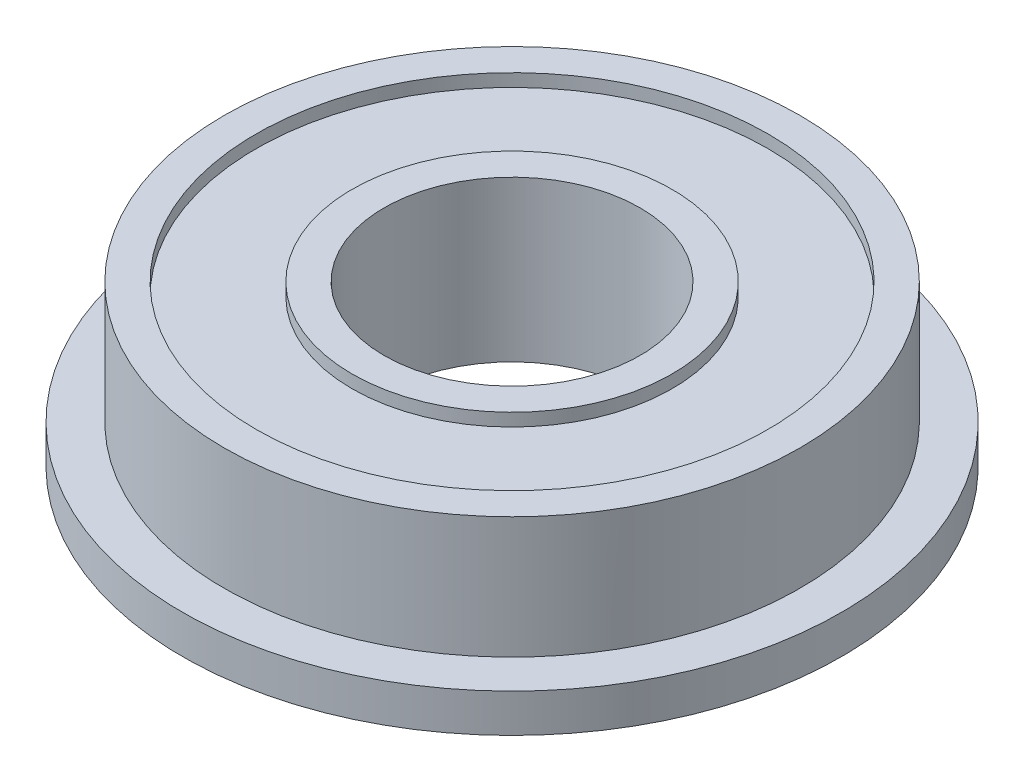
ISO-10303-21;
HEADER;
FILE_DESCRIPTION(('STEP AP214'),'2;1');
FILE_NAME('part.step','',(''),(''),'','','');
FILE_SCHEMA(('AUTOMOTIVE_DESIGN { 1 0 10303 214 1 1 1 1 }'));
ENDSEC;
DATA;
#1=APPLICATION_CONTEXT('core data for automotive mechanical design processes');
#2=APPLICATION_PROTOCOL_DEFINITION('international standard','automotive_design',2000,#1);
#3=PRODUCT_CONTEXT('',#1,'mechanical');
#4=PRODUCT('Part','Part','',(#3));
#5=PRODUCT_RELATED_PRODUCT_CATEGORY('part','',(#4));
#6=PRODUCT_DEFINITION_FORMATION('','',#4);
#7=PRODUCT_DEFINITION_CONTEXT('part definition',#1,'design');
#8=PRODUCT_DEFINITION('design','',#6,#7);
#9=PRODUCT_DEFINITION_SHAPE('','',#8);
#10=(LENGTH_UNIT() NAMED_UNIT(*) SI_UNIT(.MILLI.,.METRE.));
#11=(NAMED_UNIT(*) PLANE_ANGLE_UNIT() SI_UNIT($,.RADIAN.));
#12=(NAMED_UNIT(*) SI_UNIT($,.STERADIAN.) SOLID_ANGLE_UNIT());
#13=UNCERTAINTY_MEASURE_WITH_UNIT(LENGTH_MEASURE(1.E-05),#10,'distance_accuracy_value','');
#14=(GEOMETRIC_REPRESENTATION_CONTEXT(3) GLOBAL_UNCERTAINTY_ASSIGNED_CONTEXT((#13)) GLOBAL_UNIT_ASSIGNED_CONTEXT((#10,
#11,#12)) REPRESENTATION_CONTEXT('',''));
#15=CARTESIAN_POINT('',(0.,0.,0.));
#16=DIRECTION('',(0.,0.,1.));
#17=DIRECTION('',(1.,0.,0.));
#18=AXIS2_PLACEMENT_3D('',#15,#16,#17);
#19=CARTESIAN_POINT('',(0.,0.,0.));
#20=DIRECTION('',(0.,1.,0.));
#21=DIRECTION('',(0.,0.,1.));
#22=AXIS2_PLACEMENT_3D('',#19,#20,#21);
#23=PLANE('',#22);
#24=CARTESIAN_POINT('',(0.,0.,0.));
#25=DIRECTION('',(0.,1.,0.));
#26=DIRECTION('',(0.,0.,1.));
#27=AXIS2_PLACEMENT_3D('',#24,#25,#26);
#28=CIRCLE('',#27,2.);
#29=CARTESIAN_POINT('',(0.,0.,2.));
#30=VERTEX_POINT('',#29);
#31=EDGE_CURVE('E66',#30,#30,#28,.T.);
#32=ORIENTED_EDGE('',*,*,#31,.T.);
#33=EDGE_LOOP('',(#32));
#34=FACE_BOUND('',#33,.T.);
#35=CARTESIAN_POINT('',(0.,0.,0.));
#36=DIRECTION('',(0.,1.,0.));
#37=DIRECTION('',(0.,0.,1.));
#38=AXIS2_PLACEMENT_3D('',#35,#36,#37);
#39=CIRCLE('',#38,2.5);
#40=CARTESIAN_POINT('',(0.,0.,2.5));
#41=VERTEX_POINT('',#40);
#42=EDGE_CURVE('E103',#41,#41,#39,.T.);
#43=ORIENTED_EDGE('',*,*,#42,.F.);
#44=EDGE_LOOP('',(#43));
#45=FACE_BOUND('',#44,.T.);
#46=ADVANCED_FACE('F43',(#34,#45),#23,.F.);
#47=CARTESIAN_POINT('',(0.,2.5,0.));
#48=DIRECTION('',(0.,1.,0.));
#49=DIRECTION('',(0.,0.,1.));
#50=AXIS2_PLACEMENT_3D('',#47,#48,#49);
#51=PLANE('',#50);
#52=CARTESIAN_POINT('',(0.,2.5,0.));
#53=DIRECTION('',(0.,1.,0.));
#54=DIRECTION('',(0.,0.,1.));
#55=AXIS2_PLACEMENT_3D('',#52,#53,#54);
#56=CIRCLE('',#55,2.);
#57=CARTESIAN_POINT('',(0.,2.5,2.));
#58=VERTEX_POINT('',#57);
#59=EDGE_CURVE('E59',#58,#58,#56,.T.);
#60=ORIENTED_EDGE('',*,*,#59,.F.);
#61=EDGE_LOOP('',(#60));
#62=FACE_BOUND('',#61,.T.);
#63=CARTESIAN_POINT('',(0.,2.5,0.));
#64=DIRECTION('',(0.,1.,0.));
#65=DIRECTION('',(0.,0.,1.));
#66=AXIS2_PLACEMENT_3D('',#63,#64,#65);
#67=CIRCLE('',#66,2.5);
#68=CARTESIAN_POINT('',(0.,2.5,2.5));
#69=VERTEX_POINT('',#68);
#70=EDGE_CURVE('E88',#69,#69,#67,.T.);
#71=ORIENTED_EDGE('',*,*,#70,.T.);
#72=EDGE_LOOP('',(#71));
#73=FACE_BOUND('',#72,.T.);
#74=ADVANCED_FACE('F120',(#62,#73),#51,.T.);
#75=CARTESIAN_POINT('',(0.,2.5,0.));
#76=DIRECTION('',(0.,-1.,0.));
#77=DIRECTION('',(0.,0.,-1.));
#78=AXIS2_PLACEMENT_3D('',#75,#76,#77);
#79=CYLINDRICAL_SURFACE('',#78,4.5);
#80=CARTESIAN_POINT('',(0.,2.5,0.));
#81=DIRECTION('',(0.,1.,0.));
#82=DIRECTION('',(0.,0.,1.));
#83=AXIS2_PLACEMENT_3D('',#80,#81,#82);
#84=CIRCLE('',#83,4.5);
#85=CARTESIAN_POINT('',(0.,2.5,4.5));
#86=VERTEX_POINT('',#85);
#87=EDGE_CURVE('E47',#86,#86,#84,.T.);
#88=ORIENTED_EDGE('',*,*,#87,.F.);
#89=EDGE_LOOP('',(#88));
#90=FACE_BOUND('',#89,.T.);
#91=CARTESIAN_POINT('',(0.,0.6,0.));
#92=DIRECTION('',(0.,-1.,0.));
#93=DIRECTION('',(0.,0.,-1.));
#94=AXIS2_PLACEMENT_3D('',#91,#92,#93);
#95=CIRCLE('',#94,4.5);
#96=CARTESIAN_POINT('',(0.,0.6,-4.5));
#97=VERTEX_POINT('',#96);
#98=EDGE_CURVE('E10',#97,#97,#95,.T.);
#99=ORIENTED_EDGE('',*,*,#98,.F.);
#100=EDGE_LOOP('',(#99));
#101=FACE_BOUND('',#100,.T.);
#102=ADVANCED_FACE('F45',(#90,#101),#79,.T.);
#103=CARTESIAN_POINT('',(0.,2.5,0.));
#104=DIRECTION('',(0.,1.,0.));
#105=DIRECTION('',(0.,0.,1.));
#106=AXIS2_PLACEMENT_3D('',#103,#104,#105);
#107=CIRCLE('',#106,4.);
#108=CARTESIAN_POINT('',(0.,2.5,4.));
#109=VERTEX_POINT('',#108);
#110=EDGE_CURVE('E81',#109,#109,#107,.T.);
#111=ORIENTED_EDGE('',*,*,#110,.F.);
#112=EDGE_LOOP('',(#111));
#113=FACE_BOUND('',#112,.T.);
#114=ORIENTED_EDGE('',*,*,#87,.T.);
#115=EDGE_LOOP('',(#114));
#116=FACE_BOUND('',#115,.T.);
#117=ADVANCED_FACE('F126',(#113,#116),#51,.T.);
#118=CARTESIAN_POINT('',(0.,0.,0.));
#119=DIRECTION('',(0.,1.,0.));
#120=DIRECTION('',(0.,0.,1.));
#121=AXIS2_PLACEMENT_3D('',#118,#119,#120);
#122=CIRCLE('',#121,4.);
#123=CARTESIAN_POINT('',(0.,0.,4.));
#124=VERTEX_POINT('',#123);
#125=EDGE_CURVE('E95',#124,#124,#122,.T.);
#126=ORIENTED_EDGE('',*,*,#125,.T.);
#127=EDGE_LOOP('',(#126));
#128=FACE_BOUND('',#127,.T.);
#129=CARTESIAN_POINT('',(0.,0.,0.));
#130=DIRECTION('',(0.,-1.,0.));
#131=DIRECTION('',(0.,0.,-1.));
#132=AXIS2_PLACEMENT_3D('',#129,#130,#131);
#133=CIRCLE('',#132,5.15);
#134=CARTESIAN_POINT('',(0.,0.,-5.15));
#135=VERTEX_POINT('',#134);
#136=EDGE_CURVE('E62',#135,#135,#133,.T.);
#137=ORIENTED_EDGE('',*,*,#136,.T.);
#138=EDGE_LOOP('',(#137));
#139=FACE_BOUND('',#138,.T.);
#140=ADVANCED_FACE('F121',(#128,#139),#23,.F.);
#141=CARTESIAN_POINT('',(0.,2.5,0.));
#142=DIRECTION('',(0.,-1.,0.));
#143=DIRECTION('',(0.,0.,-1.));
#144=AXIS2_PLACEMENT_3D('',#141,#142,#143);
#145=CYLINDRICAL_SURFACE('',#144,2.);
#146=ORIENTED_EDGE('',*,*,#31,.F.);
#147=EDGE_LOOP('',(#146));
#148=FACE_BOUND('',#147,.T.);
#149=ORIENTED_EDGE('',*,*,#59,.T.);
#150=EDGE_LOOP('',(#149));
#151=FACE_BOUND('',#150,.T.);
#152=ADVANCED_FACE('F128',(#148,#151),#145,.F.);
#153=CARTESIAN_POINT('',(0.,0.6,0.));
#154=DIRECTION('',(0.,-1.,0.));
#155=DIRECTION('',(0.,0.,-1.));
#156=AXIS2_PLACEMENT_3D('',#153,#154,#155);
#157=PLANE('',#156);
#158=CARTESIAN_POINT('',(0.,0.6,0.));
#159=DIRECTION('',(0.,-1.,0.));
#160=DIRECTION('',(0.,0.,-1.));
#161=AXIS2_PLACEMENT_3D('',#158,#159,#160);
#162=CIRCLE('',#161,5.15);
#163=CARTESIAN_POINT('',(0.,0.6,-5.15));
#164=VERTEX_POINT('',#163);
#165=EDGE_CURVE('E68',#164,#164,#162,.T.);
#166=ORIENTED_EDGE('',*,*,#165,.F.);
#167=EDGE_LOOP('',(#166));
#168=FACE_BOUND('',#167,.T.);
#169=ORIENTED_EDGE('',*,*,#98,.T.);
#170=EDGE_LOOP('',(#169));
#171=FACE_BOUND('',#170,.T.);
#172=ADVANCED_FACE('F133',(#168,#171),#157,.F.);
#173=CARTESIAN_POINT('',(0.,0.6,0.));
#174=DIRECTION('',(0.,-1.,0.));
#175=DIRECTION('',(0.,0.,-1.));
#176=AXIS2_PLACEMENT_3D('',#173,#174,#175);
#177=CYLINDRICAL_SURFACE('',#176,5.15);
#178=ORIENTED_EDGE('',*,*,#165,.T.);
#179=EDGE_LOOP('',(#178));
#180=FACE_BOUND('',#179,.T.);
#181=ORIENTED_EDGE('',*,*,#136,.F.);
#182=EDGE_LOOP('',(#181));
#183=FACE_BOUND('',#182,.T.);
#184=ADVANCED_FACE('F141',(#180,#183),#177,.T.);
#185=CARTESIAN_POINT('',(0.,2.3,0.));
#186=DIRECTION('',(0.,1.,0.));
#187=DIRECTION('',(0.,0.,1.));
#188=AXIS2_PLACEMENT_3D('',#185,#186,#187);
#189=CYLINDRICAL_SURFACE('',#188,4.);
#190=CARTESIAN_POINT('',(0.,2.3,0.));
#191=DIRECTION('',(0.,1.,0.));
#192=DIRECTION('',(0.,0.,1.));
#193=AXIS2_PLACEMENT_3D('',#190,#191,#192);
#194=CIRCLE('',#193,4.);
#195=CARTESIAN_POINT('',(0.,2.3,4.));
#196=VERTEX_POINT('',#195);
#197=EDGE_CURVE('E79',#196,#196,#194,.T.);
#198=ORIENTED_EDGE('',*,*,#197,.F.);
#199=EDGE_LOOP('',(#198));
#200=FACE_BOUND('',#199,.T.);
#201=ORIENTED_EDGE('',*,*,#110,.T.);
#202=EDGE_LOOP('',(#201));
#203=FACE_BOUND('',#202,.T.);
#204=ADVANCED_FACE('F143',(#200,#203),#189,.F.);
#205=CARTESIAN_POINT('',(0.,2.3,0.));
#206=DIRECTION('',(0.,1.,0.));
#207=DIRECTION('',(0.,0.,1.));
#208=AXIS2_PLACEMENT_3D('',#205,#206,#207);
#209=PLANE('',#208);
#210=CARTESIAN_POINT('',(0.,2.3,0.));
#211=DIRECTION('',(0.,1.,0.));
#212=DIRECTION('',(0.,0.,1.));
#213=AXIS2_PLACEMENT_3D('',#210,#211,#212);
#214=CIRCLE('',#213,2.5);
#215=CARTESIAN_POINT('',(0.,2.3,2.5));
#216=VERTEX_POINT('',#215);
#217=EDGE_CURVE('E85',#216,#216,#214,.T.);
#218=ORIENTED_EDGE('',*,*,#217,.F.);
#219=EDGE_LOOP('',(#218));
#220=FACE_BOUND('',#219,.T.);
#221=ORIENTED_EDGE('',*,*,#197,.T.);
#222=EDGE_LOOP('',(#221));
#223=FACE_BOUND('',#222,.T.);
#224=ADVANCED_FACE('F148',(#220,#223),#209,.T.);
#225=CARTESIAN_POINT('',(0.,2.3,0.));
#226=DIRECTION('',(0.,1.,0.));
#227=DIRECTION('',(0.,0.,1.));
#228=AXIS2_PLACEMENT_3D('',#225,#226,#227);
#229=CYLINDRICAL_SURFACE('',#228,2.5);
#230=ORIENTED_EDGE('',*,*,#217,.T.);
#231=EDGE_LOOP('',(#230));
#232=FACE_BOUND('',#231,.T.);
#233=ORIENTED_EDGE('',*,*,#70,.F.);
#234=EDGE_LOOP('',(#233));
#235=FACE_BOUND('',#234,.T.);
#236=ADVANCED_FACE('F156',(#232,#235),#229,.T.);
#237=CARTESIAN_POINT('',(0.,0.2,0.));
#238=DIRECTION('',(0.,-1.,0.));
#239=DIRECTION('',(0.,0.,1.));
#240=AXIS2_PLACEMENT_3D('',#237,#238,#239);
#241=PLANE('',#240);
#242=CARTESIAN_POINT('',(0.,0.2,0.));
#243=DIRECTION('',(0.,1.,0.));
#244=DIRECTION('',(0.,0.,1.));
#245=AXIS2_PLACEMENT_3D('',#242,#243,#244);
#246=CIRCLE('',#245,4.);
#247=CARTESIAN_POINT('',(0.,0.2,4.));
#248=VERTEX_POINT('',#247);
#249=EDGE_CURVE('E92',#248,#248,#246,.T.);
#250=ORIENTED_EDGE('',*,*,#249,.F.);
#251=EDGE_LOOP('',(#250));
#252=FACE_BOUND('',#251,.T.);
#253=CARTESIAN_POINT('',(0.,0.2,0.));
#254=DIRECTION('',(0.,1.,0.));
#255=DIRECTION('',(0.,0.,1.));
#256=AXIS2_PLACEMENT_3D('',#253,#254,#255);
#257=CIRCLE('',#256,2.5);
#258=CARTESIAN_POINT('',(0.,0.2,2.5));
#259=VERTEX_POINT('',#258);
#260=EDGE_CURVE('E99',#259,#259,#257,.T.);
#261=ORIENTED_EDGE('',*,*,#260,.T.);
#262=EDGE_LOOP('',(#261));
#263=FACE_BOUND('',#262,.T.);
#264=ADVANCED_FACE('F110',(#252,#263),#241,.T.);
#265=CARTESIAN_POINT('',(0.,0.2,0.));
#266=DIRECTION('',(0.,-1.,0.));
#267=DIRECTION('',(0.,0.,-1.));
#268=AXIS2_PLACEMENT_3D('',#265,#266,#267);
#269=CYLINDRICAL_SURFACE('',#268,4.);
#270=ORIENTED_EDGE('',*,*,#249,.T.);
#271=EDGE_LOOP('',(#270));
#272=FACE_BOUND('',#271,.T.);
#273=ORIENTED_EDGE('',*,*,#125,.F.);
#274=EDGE_LOOP('',(#273));
#275=FACE_BOUND('',#274,.T.);
#276=ADVANCED_FACE('F115',(#272,#275),#269,.F.);
#277=CARTESIAN_POINT('',(0.,0.2,0.));
#278=DIRECTION('',(0.,-1.,0.));
#279=DIRECTION('',(0.,0.,-1.));
#280=AXIS2_PLACEMENT_3D('',#277,#278,#279);
#281=CYLINDRICAL_SURFACE('',#280,2.5);
#282=ORIENTED_EDGE('',*,*,#260,.F.);
#283=EDGE_LOOP('',(#282));
#284=FACE_BOUND('',#283,.T.);
#285=ORIENTED_EDGE('',*,*,#42,.T.);
#286=EDGE_LOOP('',(#285));
#287=FACE_BOUND('',#286,.T.);
#288=ADVANCED_FACE('F112',(#284,#287),#281,.T.);
#289=CLOSED_SHELL('',(#46,#74,#102,#117,#140,#152,#172,#184,#204,#224,#236,#264,#276,#288));
#290=MANIFOLD_SOLID_BREP('B2',#289);
#291=ADVANCED_BREP_SHAPE_REPRESENTATION('',(#18,#290),#14);
#292=SHAPE_DEFINITION_REPRESENTATION(#9,#291);
ENDSEC;
END-ISO-10303-21;
